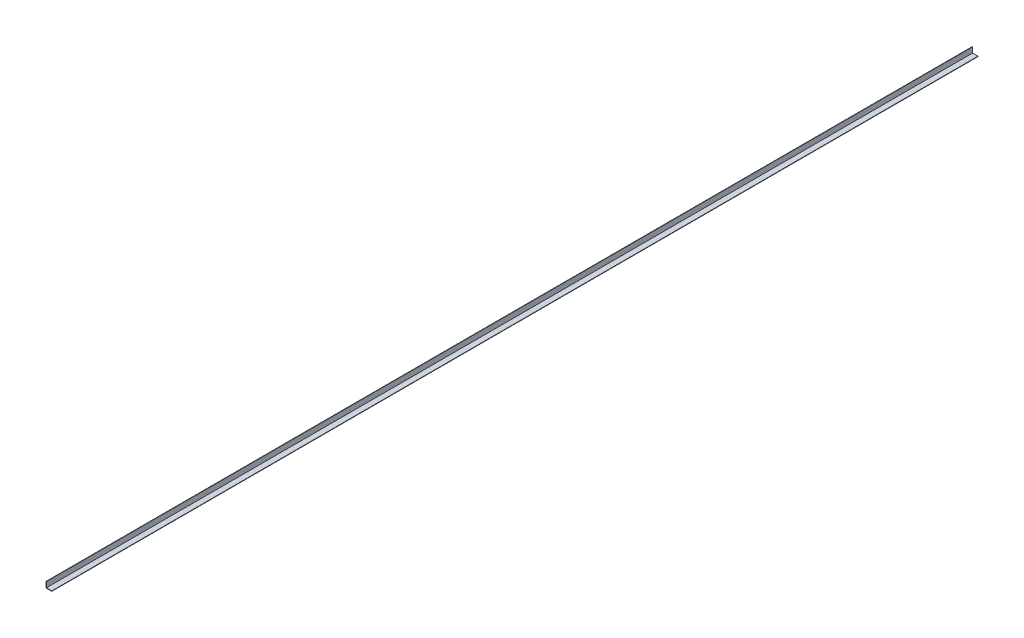
ISO-10303-21;
HEADER;
FILE_DESCRIPTION(('STEP AP214'),'2;1');
FILE_NAME('part.step','',(''),(''),'','','');
FILE_SCHEMA(('AUTOMOTIVE_DESIGN { 1 0 10303 214 1 1 1 1 }'));
ENDSEC;
DATA;
#1=APPLICATION_CONTEXT('core data for automotive mechanical design processes');
#2=APPLICATION_PROTOCOL_DEFINITION('international standard','automotive_design',2000,#1);
#3=PRODUCT_CONTEXT('',#1,'mechanical');
#4=PRODUCT('Part','Part','',(#3));
#5=PRODUCT_RELATED_PRODUCT_CATEGORY('part','',(#4));
#6=PRODUCT_DEFINITION_FORMATION('','',#4);
#7=PRODUCT_DEFINITION_CONTEXT('part definition',#1,'design');
#8=PRODUCT_DEFINITION('design','',#6,#7);
#9=PRODUCT_DEFINITION_SHAPE('','',#8);
#10=(LENGTH_UNIT() NAMED_UNIT(*) SI_UNIT(.MILLI.,.METRE.));
#11=(NAMED_UNIT(*) PLANE_ANGLE_UNIT() SI_UNIT($,.RADIAN.));
#12=(NAMED_UNIT(*) SI_UNIT($,.STERADIAN.) SOLID_ANGLE_UNIT());
#13=UNCERTAINTY_MEASURE_WITH_UNIT(LENGTH_MEASURE(1.E-05),#10,'distance_accuracy_value','');
#14=(GEOMETRIC_REPRESENTATION_CONTEXT(3) GLOBAL_UNCERTAINTY_ASSIGNED_CONTEXT((#13)) GLOBAL_UNIT_ASSIGNED_CONTEXT((#10,
#11,#12)) REPRESENTATION_CONTEXT('',''));
#15=CARTESIAN_POINT('',(0.,0.,0.));
#16=DIRECTION('',(0.,0.,1.));
#17=DIRECTION('',(1.,0.,0.));
#18=AXIS2_PLACEMENT_3D('',#15,#16,#17);
#19=CARTESIAN_POINT('',(2.7,38.1,-6100.));
#20=DIRECTION('',(0.,1.,0.));
#21=DIRECTION('',(0.,0.,1.));
#22=AXIS2_PLACEMENT_3D('',#19,#20,#21);
#23=PLANE('',#22);
#24=DIRECTION('',(-1.,0.,0.));
#25=VECTOR('',#24,1.);
#26=CARTESIAN_POINT('',(2.7,38.1,0.));
#27=LINE('',#26,#25);
#28=CARTESIAN_POINT('',(2.7,38.1,0.));
#29=VERTEX_POINT('',#28);
#30=CARTESIAN_POINT('',(0.,38.1,0.));
#31=VERTEX_POINT('',#30);
#32=EDGE_CURVE('E118',#29,#31,#27,.T.);
#33=ORIENTED_EDGE('',*,*,#32,.F.);
#34=DIRECTION('',(0.,0.,1.));
#35=VECTOR('',#34,1.);
#36=CARTESIAN_POINT('',(2.7,38.1,-6100.));
#37=LINE('',#36,#35);
#38=CARTESIAN_POINT('',(2.7,38.1,-6100.));
#39=VERTEX_POINT('',#38);
#40=EDGE_CURVE('E11',#39,#29,#37,.T.);
#41=ORIENTED_EDGE('',*,*,#40,.F.);
#42=DIRECTION('',(-1.,0.,0.));
#43=VECTOR('',#42,1.);
#44=CARTESIAN_POINT('',(2.7,38.1,-6100.));
#45=LINE('',#44,#43);
#46=CARTESIAN_POINT('',(0.,38.1,-6100.));
#47=VERTEX_POINT('',#46);
#48=EDGE_CURVE('E132',#39,#47,#45,.T.);
#49=ORIENTED_EDGE('',*,*,#48,.T.);
#50=DIRECTION('',(0.,0.,1.));
#51=VECTOR('',#50,1.);
#52=CARTESIAN_POINT('',(0.,38.1,-6100.));
#53=LINE('',#52,#51);
#54=EDGE_CURVE('E36',#47,#31,#53,.T.);
#55=ORIENTED_EDGE('',*,*,#54,.T.);
#56=EDGE_LOOP('',(#33,#41,#49,#55));
#57=FACE_BOUND('',#56,.T.);
#58=ADVANCED_FACE('F33',(#57),#23,.T.);
#59=CARTESIAN_POINT('',(2.7,2.7,-6100.));
#60=DIRECTION('',(1.,0.,0.));
#61=DIRECTION('',(0.,1.,0.));
#62=AXIS2_PLACEMENT_3D('',#59,#60,#61);
#63=PLANE('',#62);
#64=DIRECTION('',(0.,1.,0.));
#65=VECTOR('',#64,1.);
#66=CARTESIAN_POINT('',(2.7,2.7,0.));
#67=LINE('',#66,#65);
#68=CARTESIAN_POINT('',(2.7,2.7,0.));
#69=VERTEX_POINT('',#68);
#70=EDGE_CURVE('E130',#69,#29,#67,.T.);
#71=ORIENTED_EDGE('',*,*,#70,.F.);
#72=DIRECTION('',(0.,0.,1.));
#73=VECTOR('',#72,1.);
#74=CARTESIAN_POINT('',(2.7,2.7,-6100.));
#75=LINE('',#74,#73);
#76=CARTESIAN_POINT('',(2.7,2.7,-6100.));
#77=VERTEX_POINT('',#76);
#78=EDGE_CURVE('E42',#77,#69,#75,.T.);
#79=ORIENTED_EDGE('',*,*,#78,.F.);
#80=DIRECTION('',(0.,1.,0.));
#81=VECTOR('',#80,1.);
#82=CARTESIAN_POINT('',(2.7,2.7,-6100.));
#83=LINE('',#82,#81);
#84=EDGE_CURVE('E108',#77,#39,#83,.T.);
#85=ORIENTED_EDGE('',*,*,#84,.T.);
#86=ORIENTED_EDGE('',*,*,#40,.T.);
#87=EDGE_LOOP('',(#71,#79,#85,#86));
#88=FACE_BOUND('',#87,.T.);
#89=ADVANCED_FACE('F140',(#88),#63,.T.);
#90=CARTESIAN_POINT('',(38.1,2.7,-6100.));
#91=DIRECTION('',(0.,1.,0.));
#92=DIRECTION('',(-1.,0.,0.));
#93=AXIS2_PLACEMENT_3D('',#90,#91,#92);
#94=PLANE('',#93);
#95=DIRECTION('',(-1.,0.,0.));
#96=VECTOR('',#95,1.);
#97=CARTESIAN_POINT('',(38.1,2.7,0.));
#98=LINE('',#97,#96);
#99=CARTESIAN_POINT('',(38.1,2.7,0.));
#100=VERTEX_POINT('',#99);
#101=EDGE_CURVE('E95',#100,#69,#98,.T.);
#102=ORIENTED_EDGE('',*,*,#101,.F.);
#103=DIRECTION('',(0.,0.,1.));
#104=VECTOR('',#103,1.);
#105=CARTESIAN_POINT('',(38.1,2.7,-6100.));
#106=LINE('',#105,#104);
#107=CARTESIAN_POINT('',(38.1,2.7,-6100.));
#108=VERTEX_POINT('',#107);
#109=EDGE_CURVE('E90',#108,#100,#106,.T.);
#110=ORIENTED_EDGE('',*,*,#109,.F.);
#111=DIRECTION('',(-1.,0.,0.));
#112=VECTOR('',#111,1.);
#113=CARTESIAN_POINT('',(38.1,2.7,-6100.));
#114=LINE('',#113,#112);
#115=EDGE_CURVE('E93',#108,#77,#114,.T.);
#116=ORIENTED_EDGE('',*,*,#115,.T.);
#117=ORIENTED_EDGE('',*,*,#78,.T.);
#118=EDGE_LOOP('',(#102,#110,#116,#117));
#119=FACE_BOUND('',#118,.T.);
#120=ADVANCED_FACE('F92',(#119),#94,.T.);
#121=CARTESIAN_POINT('',(38.1,0.,-6100.));
#122=DIRECTION('',(1.,0.,0.));
#123=DIRECTION('',(0.,0.,-1.));
#124=AXIS2_PLACEMENT_3D('',#121,#122,#123);
#125=PLANE('',#124);
#126=DIRECTION('',(0.,1.,0.));
#127=VECTOR('',#126,1.);
#128=CARTESIAN_POINT('',(38.1,0.,0.));
#129=LINE('',#128,#127);
#130=CARTESIAN_POINT('',(38.1,0.,0.));
#131=VERTEX_POINT('',#130);
#132=EDGE_CURVE('E127',#131,#100,#129,.T.);
#133=ORIENTED_EDGE('',*,*,#132,.F.);
#134=DIRECTION('',(0.,0.,1.));
#135=VECTOR('',#134,1.);
#136=CARTESIAN_POINT('',(38.1,0.,-6100.));
#137=LINE('',#136,#135);
#138=CARTESIAN_POINT('',(38.1,0.,-6100.));
#139=VERTEX_POINT('',#138);
#140=EDGE_CURVE('E100',#139,#131,#137,.T.);
#141=ORIENTED_EDGE('',*,*,#140,.F.);
#142=DIRECTION('',(0.,1.,0.));
#143=VECTOR('',#142,1.);
#144=CARTESIAN_POINT('',(38.1,0.,-6100.));
#145=LINE('',#144,#143);
#146=EDGE_CURVE('E106',#139,#108,#145,.T.);
#147=ORIENTED_EDGE('',*,*,#146,.T.);
#148=ORIENTED_EDGE('',*,*,#109,.T.);
#149=EDGE_LOOP('',(#133,#141,#147,#148));
#150=FACE_BOUND('',#149,.T.);
#151=ADVANCED_FACE('F110',(#150),#125,.T.);
#152=CARTESIAN_POINT('',(0.,0.,-6100.));
#153=DIRECTION('',(0.,-1.,0.));
#154=DIRECTION('',(0.,0.,-1.));
#155=AXIS2_PLACEMENT_3D('',#152,#153,#154);
#156=PLANE('',#155);
#157=DIRECTION('',(1.,0.,0.));
#158=VECTOR('',#157,1.);
#159=CARTESIAN_POINT('',(0.,0.,0.));
#160=LINE('',#159,#158);
#161=CARTESIAN_POINT('',(0.,0.,0.));
#162=VERTEX_POINT('',#161);
#163=EDGE_CURVE('E124',#162,#131,#160,.T.);
#164=ORIENTED_EDGE('',*,*,#163,.F.);
#165=DIRECTION('',(0.,0.,1.));
#166=VECTOR('',#165,1.);
#167=CARTESIAN_POINT('',(0.,0.,-6100.));
#168=LINE('',#167,#166);
#169=CARTESIAN_POINT('',(0.,0.,-6100.));
#170=VERTEX_POINT('',#169);
#171=EDGE_CURVE('E135',#170,#162,#168,.T.);
#172=ORIENTED_EDGE('',*,*,#171,.F.);
#173=DIRECTION('',(1.,0.,0.));
#174=VECTOR('',#173,1.);
#175=CARTESIAN_POINT('',(0.,0.,-6100.));
#176=LINE('',#175,#174);
#177=EDGE_CURVE('E111',#170,#139,#176,.T.);
#178=ORIENTED_EDGE('',*,*,#177,.T.);
#179=ORIENTED_EDGE('',*,*,#140,.T.);
#180=EDGE_LOOP('',(#164,#172,#178,#179));
#181=FACE_BOUND('',#180,.T.);
#182=ADVANCED_FACE('F153',(#181),#156,.T.);
#183=CARTESIAN_POINT('',(0.,38.1,-6100.));
#184=DIRECTION('',(-1.,0.,0.));
#185=DIRECTION('',(0.,-1.,0.));
#186=AXIS2_PLACEMENT_3D('',#183,#184,#185);
#187=PLANE('',#186);
#188=DIRECTION('',(0.,-1.,0.));
#189=VECTOR('',#188,1.);
#190=CARTESIAN_POINT('',(0.,38.1,0.));
#191=LINE('',#190,#189);
#192=EDGE_CURVE('E121',#31,#162,#191,.T.);
#193=ORIENTED_EDGE('',*,*,#192,.F.);
#194=ORIENTED_EDGE('',*,*,#54,.F.);
#195=DIRECTION('',(0.,-1.,0.));
#196=VECTOR('',#195,1.);
#197=CARTESIAN_POINT('',(0.,38.1,-6100.));
#198=LINE('',#197,#196);
#199=EDGE_CURVE('E113',#47,#170,#198,.T.);
#200=ORIENTED_EDGE('',*,*,#199,.T.);
#201=ORIENTED_EDGE('',*,*,#171,.T.);
#202=EDGE_LOOP('',(#193,#194,#200,#201));
#203=FACE_BOUND('',#202,.T.);
#204=ADVANCED_FACE('F137',(#203),#187,.T.);
#205=CARTESIAN_POINT('',(0.,0.,-6100.));
#206=DIRECTION('',(0.,0.,1.));
#207=DIRECTION('',(1.,0.,0.));
#208=AXIS2_PLACEMENT_3D('',#205,#206,#207);
#209=PLANE('',#208);
#210=ORIENTED_EDGE('',*,*,#48,.F.);
#211=ORIENTED_EDGE('',*,*,#84,.F.);
#212=ORIENTED_EDGE('',*,*,#115,.F.);
#213=ORIENTED_EDGE('',*,*,#146,.F.);
#214=ORIENTED_EDGE('',*,*,#177,.F.);
#215=ORIENTED_EDGE('',*,*,#199,.F.);
#216=EDGE_LOOP('',(#210,#211,#212,#213,#214,#215));
#217=FACE_BOUND('',#216,.T.);
#218=ADVANCED_FACE('F104',(#217),#209,.F.);
#219=CARTESIAN_POINT('',(0.,0.,0.));
#220=DIRECTION('',(0.,0.,1.));
#221=DIRECTION('',(1.,0.,0.));
#222=AXIS2_PLACEMENT_3D('',#219,#220,#221);
#223=PLANE('',#222);
#224=ORIENTED_EDGE('',*,*,#32,.T.);
#225=ORIENTED_EDGE('',*,*,#192,.T.);
#226=ORIENTED_EDGE('',*,*,#163,.T.);
#227=ORIENTED_EDGE('',*,*,#132,.T.);
#228=ORIENTED_EDGE('',*,*,#101,.T.);
#229=ORIENTED_EDGE('',*,*,#70,.T.);
#230=EDGE_LOOP('',(#224,#225,#226,#227,#228,#229));
#231=FACE_BOUND('',#230,.T.);
#232=ADVANCED_FACE('F139',(#231),#223,.T.);
#233=CLOSED_SHELL('',(#58,#89,#120,#151,#182,#204,#218,#232));
#234=MANIFOLD_SOLID_BREP('B2',#233);
#235=ADVANCED_BREP_SHAPE_REPRESENTATION('',(#18,#234),#14);
#236=SHAPE_DEFINITION_REPRESENTATION(#9,#235);
ENDSEC;
END-ISO-10303-21;
